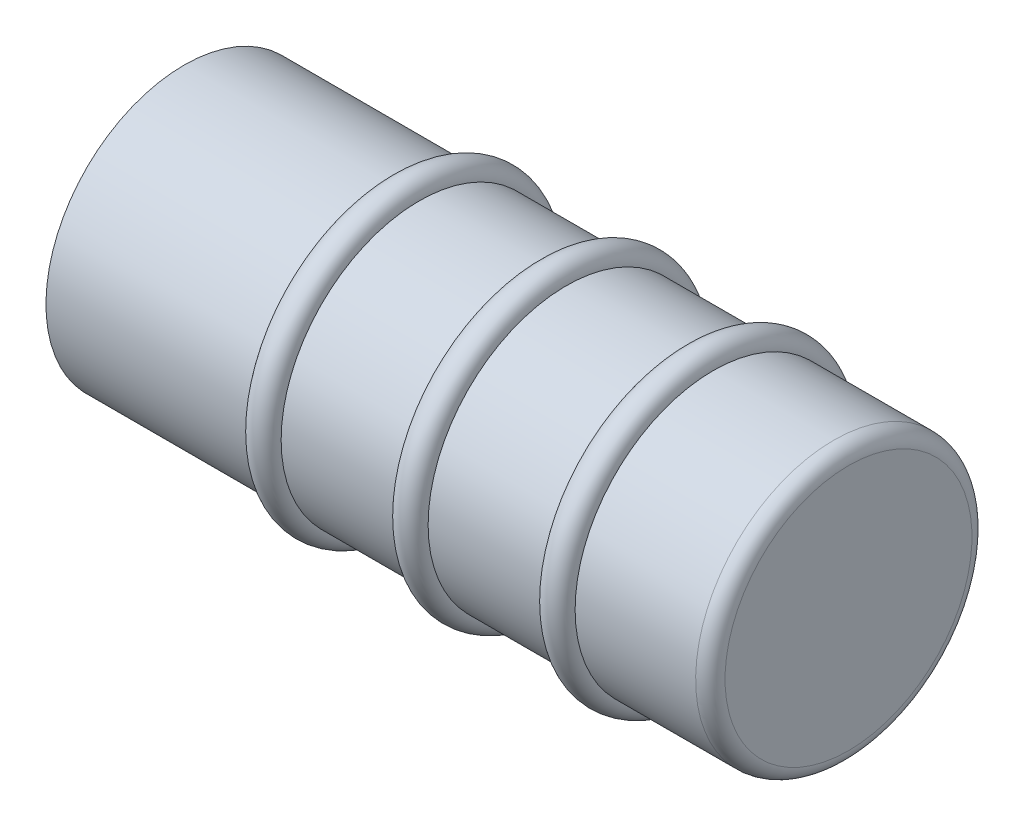
ISO-10303-21;
HEADER;
FILE_DESCRIPTION(('STEP AP214'),'2;1');
FILE_NAME('part.step','',(''),(''),'','','');
FILE_SCHEMA(('AUTOMOTIVE_DESIGN { 1 0 10303 214 1 1 1 1 }'));
ENDSEC;
DATA;
#1=APPLICATION_CONTEXT('core data for automotive mechanical design processes');
#2=APPLICATION_PROTOCOL_DEFINITION('international standard','automotive_design',2000,#1);
#3=PRODUCT_CONTEXT('',#1,'mechanical');
#4=PRODUCT('Part','Part','',(#3));
#5=PRODUCT_RELATED_PRODUCT_CATEGORY('part','',(#4));
#6=PRODUCT_DEFINITION_FORMATION('','',#4);
#7=PRODUCT_DEFINITION_CONTEXT('part definition',#1,'design');
#8=PRODUCT_DEFINITION('design','',#6,#7);
#9=PRODUCT_DEFINITION_SHAPE('','',#8);
#10=(LENGTH_UNIT() NAMED_UNIT(*) SI_UNIT(.MILLI.,.METRE.));
#11=(NAMED_UNIT(*) PLANE_ANGLE_UNIT() SI_UNIT($,.RADIAN.));
#12=(NAMED_UNIT(*) SI_UNIT($,.STERADIAN.) SOLID_ANGLE_UNIT());
#13=UNCERTAINTY_MEASURE_WITH_UNIT(LENGTH_MEASURE(1.E-05),#10,'distance_accuracy_value','');
#14=(GEOMETRIC_REPRESENTATION_CONTEXT(3) GLOBAL_UNCERTAINTY_ASSIGNED_CONTEXT((#13)) GLOBAL_UNIT_ASSIGNED_CONTEXT((#10,
#11,#12)) REPRESENTATION_CONTEXT('',''));
#15=CARTESIAN_POINT('',(0.,0.,0.));
#16=DIRECTION('',(0.,0.,1.));
#17=DIRECTION('',(1.,0.,0.));
#18=AXIS2_PLACEMENT_3D('',#15,#16,#17);
#19=CARTESIAN_POINT('',(0.,0.,0.));
#20=DIRECTION('',(1.,0.,0.));
#21=DIRECTION('',(0.,1.,0.));
#22=AXIS2_PLACEMENT_3D('',#19,#20,#21);
#23=CYLINDRICAL_SURFACE('',#22,4.7);
#24=CARTESIAN_POINT('',(-9.6,0.,0.));
#25=DIRECTION('',(-1.,0.,0.));
#26=DIRECTION('',(0.,0.,1.));
#27=AXIS2_PLACEMENT_3D('',#24,#25,#26);
#28=CIRCLE('',#27,4.7);
#29=CARTESIAN_POINT('',(-9.6,0.,4.7));
#30=VERTEX_POINT('',#29);
#31=EDGE_CURVE('E55',#30,#30,#28,.F.);
#32=ORIENTED_EDGE('',*,*,#31,.T.);
#33=EDGE_LOOP('',(#32));
#34=FACE_BOUND('',#33,.T.);
#35=CARTESIAN_POINT('',(-5.6,0.,0.));
#36=DIRECTION('',(1.,0.,0.));
#37=DIRECTION('',(0.,0.,-1.));
#38=AXIS2_PLACEMENT_3D('',#35,#36,#37);
#39=CIRCLE('',#38,4.7);
#40=CARTESIAN_POINT('',(-5.6,0.,-4.7));
#41=VERTEX_POINT('',#40);
#42=EDGE_CURVE('E35',#41,#41,#39,.F.);
#43=ORIENTED_EDGE('',*,*,#42,.T.);
#44=EDGE_LOOP('',(#43));
#45=FACE_BOUND('',#44,.T.);
#46=ADVANCED_FACE('F31',(#34,#45),#23,.T.);
#47=CARTESIAN_POINT('',(-14.6,0.,0.));
#48=DIRECTION('',(-1.,0.,0.));
#49=DIRECTION('',(0.,0.,1.));
#50=AXIS2_PLACEMENT_3D('',#47,#48,#49);
#51=CIRCLE('',#50,4.7);
#52=CARTESIAN_POINT('',(-14.6,0.,4.7));
#53=VERTEX_POINT('',#52);
#54=EDGE_CURVE('E48',#53,#53,#51,.F.);
#55=ORIENTED_EDGE('',*,*,#54,.T.);
#56=EDGE_LOOP('',(#55));
#57=FACE_BOUND('',#56,.T.);
#58=CARTESIAN_POINT('',(-10.6,0.,0.));
#59=DIRECTION('',(1.,0.,0.));
#60=DIRECTION('',(0.,0.,-1.));
#61=AXIS2_PLACEMENT_3D('',#58,#59,#60);
#62=CIRCLE('',#61,4.7);
#63=CARTESIAN_POINT('',(-10.6,0.,-4.7));
#64=VERTEX_POINT('',#63);
#65=EDGE_CURVE('E52',#64,#64,#62,.F.);
#66=ORIENTED_EDGE('',*,*,#65,.T.);
#67=EDGE_LOOP('',(#66));
#68=FACE_BOUND('',#67,.T.);
#69=ADVANCED_FACE('F84',(#57,#68),#23,.T.);
#70=CARTESIAN_POINT('',(-15.1,0.,0.));
#71=DIRECTION('',(-1.,0.,0.));
#72=DIRECTION('',(0.,0.,1.));
#73=AXIS2_PLACEMENT_3D('',#70,#71,#72);
#74=TOROIDAL_SURFACE('',#73,4.7,0.500000000000001);
#75=CARTESIAN_POINT('',(-15.6,0.,0.));
#76=DIRECTION('',(1.,0.,0.));
#77=DIRECTION('',(0.,0.,-1.));
#78=AXIS2_PLACEMENT_3D('',#75,#76,#77);
#79=CIRCLE('',#78,4.7);
#80=CARTESIAN_POINT('',(-15.6,0.,-4.7));
#81=VERTEX_POINT('',#80);
#82=EDGE_CURVE('E51',#81,#81,#79,.F.);
#83=ORIENTED_EDGE('',*,*,#82,.F.);
#84=EDGE_LOOP('',(#83));
#85=FACE_BOUND('',#84,.T.);
#86=ORIENTED_EDGE('',*,*,#54,.F.);
#87=EDGE_LOOP('',(#86));
#88=FACE_BOUND('',#87,.T.);
#89=ADVANCED_FACE('F90',(#85,#88),#74,.T.);
#90=CARTESIAN_POINT('',(-22.6,4.69999999999999,0.));
#91=DIRECTION('',(-1.,0.,0.));
#92=DIRECTION('',(0.,-1.,0.));
#93=AXIS2_PLACEMENT_3D('',#90,#91,#92);
#94=PLANE('',#93);
#95=CARTESIAN_POINT('',(-22.6,0.,0.));
#96=DIRECTION('',(1.,0.,0.));
#97=DIRECTION('',(0.,1.,0.));
#98=AXIS2_PLACEMENT_3D('',#95,#96,#97);
#99=CIRCLE('',#98,4.7);
#100=CARTESIAN_POINT('',(-22.6,4.69999999999999,0.));
#101=VERTEX_POINT('',#100);
#102=EDGE_CURVE('E10',#101,#101,#99,.T.);
#103=ORIENTED_EDGE('',*,*,#102,.F.);
#104=EDGE_LOOP('',(#103));
#105=FACE_BOUND('',#104,.T.);
#106=ADVANCED_FACE('F33',(#105),#94,.T.);
#107=ORIENTED_EDGE('',*,*,#102,.T.);
#108=EDGE_LOOP('',(#107));
#109=FACE_BOUND('',#108,.T.);
#110=ORIENTED_EDGE('',*,*,#82,.T.);
#111=EDGE_LOOP('',(#110));
#112=FACE_BOUND('',#111,.T.);
#113=ADVANCED_FACE('F80',(#109,#112),#23,.T.);
#114=CARTESIAN_POINT('',(-10.1,0.,0.));
#115=DIRECTION('',(-1.,0.,0.));
#116=DIRECTION('',(0.,0.,1.));
#117=AXIS2_PLACEMENT_3D('',#114,#115,#116);
#118=TOROIDAL_SURFACE('',#117,4.7,0.500000000000001);
#119=ORIENTED_EDGE('',*,*,#65,.F.);
#120=EDGE_LOOP('',(#119));
#121=FACE_BOUND('',#120,.T.);
#122=ORIENTED_EDGE('',*,*,#31,.F.);
#123=EDGE_LOOP('',(#122));
#124=FACE_BOUND('',#123,.T.);
#125=ADVANCED_FACE('F71',(#121,#124),#118,.T.);
#126=CARTESIAN_POINT('',(-5.1,0.,0.));
#127=DIRECTION('',(-1.,0.,0.));
#128=DIRECTION('',(0.,0.,1.));
#129=AXIS2_PLACEMENT_3D('',#126,#127,#128);
#130=TOROIDAL_SURFACE('',#129,4.7,0.500000000000001);
#131=ORIENTED_EDGE('',*,*,#42,.F.);
#132=EDGE_LOOP('',(#131));
#133=FACE_BOUND('',#132,.T.);
#134=CARTESIAN_POINT('',(-4.6,0.,0.));
#135=DIRECTION('',(-1.,0.,0.));
#136=DIRECTION('',(0.,0.,1.));
#137=AXIS2_PLACEMENT_3D('',#134,#135,#136);
#138=CIRCLE('',#137,4.7);
#139=CARTESIAN_POINT('',(-4.6,0.,4.7));
#140=VERTEX_POINT('',#139);
#141=EDGE_CURVE('E59',#140,#140,#138,.F.);
#142=ORIENTED_EDGE('',*,*,#141,.F.);
#143=EDGE_LOOP('',(#142));
#144=FACE_BOUND('',#143,.T.);
#145=ADVANCED_FACE('F67',(#133,#144),#130,.T.);
#146=CARTESIAN_POINT('',(0.,4.19999999999999,0.));
#147=DIRECTION('',(1.,0.,0.));
#148=DIRECTION('',(0.,1.,0.));
#149=AXIS2_PLACEMENT_3D('',#146,#147,#148);
#150=PLANE('',#149);
#151=CARTESIAN_POINT('',(0.,0.,0.));
#152=DIRECTION('',(1.,0.,0.));
#153=DIRECTION('',(0.,1.,0.));
#154=AXIS2_PLACEMENT_3D('',#151,#152,#153);
#155=CIRCLE('',#154,4.19999999999999);
#156=CARTESIAN_POINT('',(0.,4.19999999999999,0.));
#157=VERTEX_POINT('',#156);
#158=EDGE_CURVE('E44',#157,#157,#155,.T.);
#159=ORIENTED_EDGE('',*,*,#158,.T.);
#160=EDGE_LOOP('',(#159));
#161=FACE_BOUND('',#160,.T.);
#162=ADVANCED_FACE('F70',(#161),#150,.T.);
#163=CARTESIAN_POINT('',(-0.499999999999999,0.,0.));
#164=DIRECTION('',(1.,0.,0.));
#165=DIRECTION('',(0.,1.,0.));
#166=AXIS2_PLACEMENT_3D('',#163,#164,#165);
#167=TOROIDAL_SURFACE('',#166,4.2,0.5);
#168=CARTESIAN_POINT('',(-0.500000000000002,0.,0.));
#169=DIRECTION('',(1.,0.,0.));
#170=DIRECTION('',(0.,1.,0.));
#171=AXIS2_PLACEMENT_3D('',#168,#169,#170);
#172=CIRCLE('',#171,4.7);
#173=CARTESIAN_POINT('',(-0.500000000000004,4.7,0.));
#174=VERTEX_POINT('',#173);
#175=EDGE_CURVE('E39',#174,#174,#172,.T.);
#176=ORIENTED_EDGE('',*,*,#175,.T.);
#177=EDGE_LOOP('',(#176));
#178=FACE_BOUND('',#177,.T.);
#179=ORIENTED_EDGE('',*,*,#158,.F.);
#180=EDGE_LOOP('',(#179));
#181=FACE_BOUND('',#180,.T.);
#182=ADVANCED_FACE('F77',(#178,#181),#167,.T.);
#183=ORIENTED_EDGE('',*,*,#175,.F.);
#184=EDGE_LOOP('',(#183));
#185=FACE_BOUND('',#184,.T.);
#186=ORIENTED_EDGE('',*,*,#141,.T.);
#187=EDGE_LOOP('',(#186));
#188=FACE_BOUND('',#187,.T.);
#189=ADVANCED_FACE('F86',(#185,#188),#23,.T.);
#190=CLOSED_SHELL('',(#46,#69,#89,#106,#113,#125,#145,#162,#182,#189));
#191=MANIFOLD_SOLID_BREP('B2',#190);
#192=ADVANCED_BREP_SHAPE_REPRESENTATION('',(#18,#191),#14);
#193=SHAPE_DEFINITION_REPRESENTATION(#9,#192);
ENDSEC;
END-ISO-10303-21;
